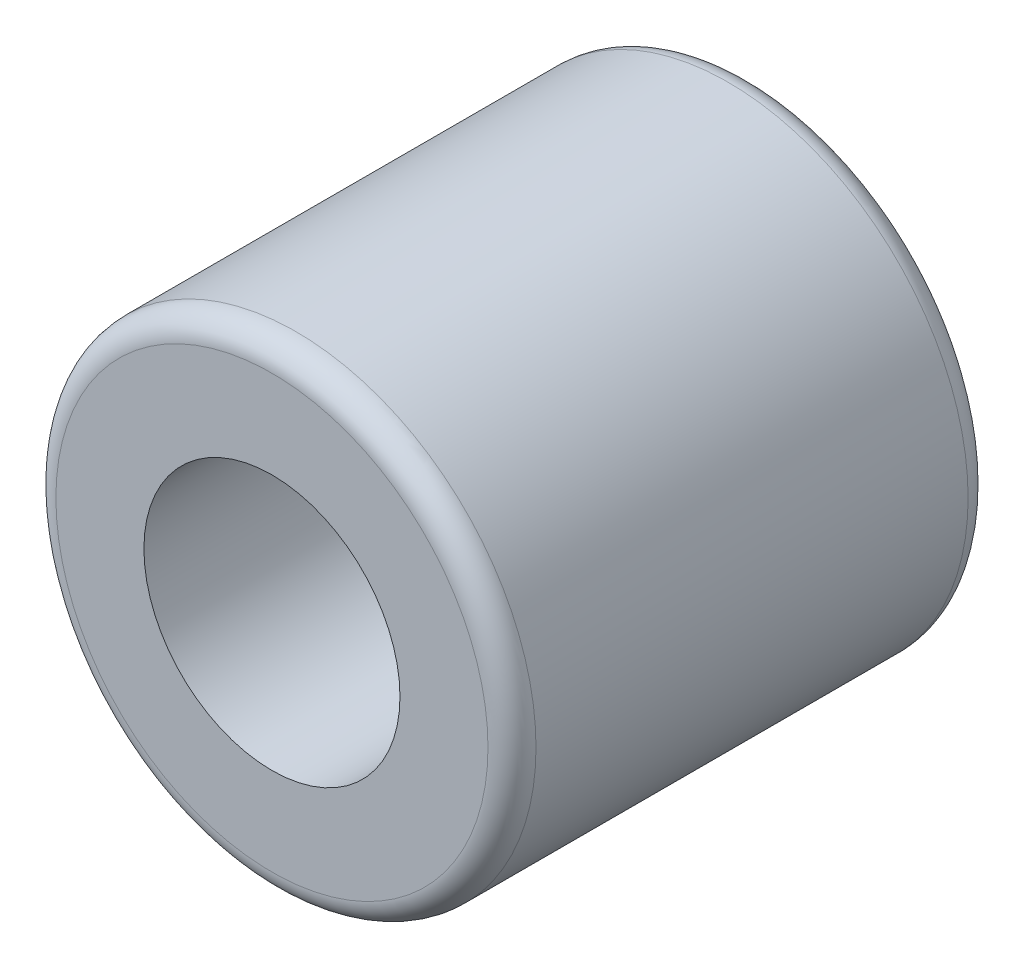
ISO-10303-21;
HEADER;
FILE_DESCRIPTION(('STEP AP214'),'2;1');
FILE_NAME('part.step','',(''),(''),'','','');
FILE_SCHEMA(('AUTOMOTIVE_DESIGN { 1 0 10303 214 1 1 1 1 }'));
ENDSEC;
DATA;
#1=APPLICATION_CONTEXT('core data for automotive mechanical design processes');
#2=APPLICATION_PROTOCOL_DEFINITION('international standard','automotive_design',2000,#1);
#3=PRODUCT_CONTEXT('',#1,'mechanical');
#4=PRODUCT('Part','Part','',(#3));
#5=PRODUCT_RELATED_PRODUCT_CATEGORY('part','',(#4));
#6=PRODUCT_DEFINITION_FORMATION('','',#4);
#7=PRODUCT_DEFINITION_CONTEXT('part definition',#1,'design');
#8=PRODUCT_DEFINITION('design','',#6,#7);
#9=PRODUCT_DEFINITION_SHAPE('','',#8);
#10=(LENGTH_UNIT() NAMED_UNIT(*) SI_UNIT(.MILLI.,.METRE.));
#11=(NAMED_UNIT(*) PLANE_ANGLE_UNIT() SI_UNIT($,.RADIAN.));
#12=(NAMED_UNIT(*) SI_UNIT($,.STERADIAN.) SOLID_ANGLE_UNIT());
#13=UNCERTAINTY_MEASURE_WITH_UNIT(LENGTH_MEASURE(1.E-05),#10,'distance_accuracy_value','');
#14=(GEOMETRIC_REPRESENTATION_CONTEXT(3) GLOBAL_UNCERTAINTY_ASSIGNED_CONTEXT((#13)) GLOBAL_UNIT_ASSIGNED_CONTEXT((#10,
#11,#12)) REPRESENTATION_CONTEXT('',''));
#15=CARTESIAN_POINT('',(0.,0.,0.));
#16=DIRECTION('',(0.,0.,1.));
#17=DIRECTION('',(1.,0.,0.));
#18=AXIS2_PLACEMENT_3D('',#15,#16,#17);
#19=CARTESIAN_POINT('',(0.,0.,6.));
#20=DIRECTION('',(0.,0.,1.));
#21=DIRECTION('',(1.,0.,0.));
#22=AXIS2_PLACEMENT_3D('',#19,#20,#21);
#23=PLANE('',#22);
#24=CARTESIAN_POINT('',(0.,0.,6.));
#25=DIRECTION('',(0.,0.,1.));
#26=DIRECTION('',(1.,0.,0.));
#27=AXIS2_PLACEMENT_3D('',#24,#25,#26);
#28=CIRCLE('',#27,2.7);
#29=CARTESIAN_POINT('',(2.7,0.,6.));
#30=VERTEX_POINT('',#29);
#31=EDGE_CURVE('E10',#30,#30,#28,.T.);
#32=ORIENTED_EDGE('',*,*,#31,.T.);
#33=EDGE_LOOP('',(#32));
#34=FACE_BOUND('',#33,.T.);
#35=CARTESIAN_POINT('',(0.,0.,6.));
#36=DIRECTION('',(0.,0.,1.));
#37=DIRECTION('',(1.,0.,0.));
#38=AXIS2_PLACEMENT_3D('',#35,#36,#37);
#39=CIRCLE('',#38,1.6);
#40=CARTESIAN_POINT('',(1.6,0.,6.));
#41=VERTEX_POINT('',#40);
#42=EDGE_CURVE('E51',#41,#41,#39,.T.);
#43=ORIENTED_EDGE('',*,*,#42,.F.);
#44=EDGE_LOOP('',(#43));
#45=FACE_BOUND('',#44,.T.);
#46=ADVANCED_FACE('F31',(#34,#45),#23,.T.);
#47=CARTESIAN_POINT('',(0.,0.,0.));
#48=DIRECTION('',(0.,0.,1.));
#49=DIRECTION('',(1.,0.,0.));
#50=AXIS2_PLACEMENT_3D('',#47,#48,#49);
#51=PLANE('',#50);
#52=CARTESIAN_POINT('',(0.,0.,0.));
#53=DIRECTION('',(0.,0.,1.));
#54=DIRECTION('',(1.,0.,0.));
#55=AXIS2_PLACEMENT_3D('',#52,#53,#54);
#56=CIRCLE('',#55,2.7);
#57=CARTESIAN_POINT('',(2.7,0.,0.));
#58=VERTEX_POINT('',#57);
#59=EDGE_CURVE('E38',#58,#58,#56,.F.);
#60=ORIENTED_EDGE('',*,*,#59,.T.);
#61=EDGE_LOOP('',(#60));
#62=FACE_BOUND('',#61,.T.);
#63=CARTESIAN_POINT('',(0.,0.,0.));
#64=DIRECTION('',(0.,0.,1.));
#65=DIRECTION('',(1.,0.,0.));
#66=AXIS2_PLACEMENT_3D('',#63,#64,#65);
#67=CIRCLE('',#66,1.6);
#68=CARTESIAN_POINT('',(1.6,0.,0.));
#69=VERTEX_POINT('',#68);
#70=EDGE_CURVE('E52',#69,#69,#67,.T.);
#71=ORIENTED_EDGE('',*,*,#70,.T.);
#72=EDGE_LOOP('',(#71));
#73=FACE_BOUND('',#72,.T.);
#74=ADVANCED_FACE('F62',(#62,#73),#51,.F.);
#75=CARTESIAN_POINT('',(0.,0.,6.));
#76=DIRECTION('',(0.,0.,-1.));
#77=DIRECTION('',(-1.,0.,0.));
#78=AXIS2_PLACEMENT_3D('',#75,#76,#77);
#79=CYLINDRICAL_SURFACE('',#78,3.);
#80=CARTESIAN_POINT('',(0.,0.,0.3));
#81=DIRECTION('',(0.,0.,1.));
#82=DIRECTION('',(1.,0.,0.));
#83=AXIS2_PLACEMENT_3D('',#80,#81,#82);
#84=CIRCLE('',#83,3.);
#85=CARTESIAN_POINT('',(3.,0.,0.3));
#86=VERTEX_POINT('',#85);
#87=EDGE_CURVE('E42',#86,#86,#84,.T.);
#88=ORIENTED_EDGE('',*,*,#87,.T.);
#89=EDGE_LOOP('',(#88));
#90=FACE_BOUND('',#89,.T.);
#91=CARTESIAN_POINT('',(0.,0.,5.7));
#92=DIRECTION('',(0.,0.,1.));
#93=DIRECTION('',(1.,0.,0.));
#94=AXIS2_PLACEMENT_3D('',#91,#92,#93);
#95=CIRCLE('',#94,3.);
#96=CARTESIAN_POINT('',(3.,0.,5.7));
#97=VERTEX_POINT('',#96);
#98=EDGE_CURVE('E46',#97,#97,#95,.F.);
#99=ORIENTED_EDGE('',*,*,#98,.T.);
#100=EDGE_LOOP('',(#99));
#101=FACE_BOUND('',#100,.T.);
#102=ADVANCED_FACE('F67',(#90,#101),#79,.T.);
#103=CARTESIAN_POINT('',(0.,0.,6.));
#104=DIRECTION('',(0.,0.,-1.));
#105=DIRECTION('',(-1.,0.,0.));
#106=AXIS2_PLACEMENT_3D('',#103,#104,#105);
#107=CYLINDRICAL_SURFACE('',#106,1.6);
#108=ORIENTED_EDGE('',*,*,#42,.T.);
#109=EDGE_LOOP('',(#108));
#110=FACE_BOUND('',#109,.T.);
#111=ORIENTED_EDGE('',*,*,#70,.F.);
#112=EDGE_LOOP('',(#111));
#113=FACE_BOUND('',#112,.T.);
#114=ADVANCED_FACE('F58',(#110,#113),#107,.F.);
#115=CARTESIAN_POINT('',(0.,0.,0.3));
#116=DIRECTION('',(0.,0.,1.));
#117=DIRECTION('',(1.,0.,0.));
#118=AXIS2_PLACEMENT_3D('',#115,#116,#117);
#119=TOROIDAL_SURFACE('',#118,2.7,0.3);
#120=ORIENTED_EDGE('',*,*,#59,.F.);
#121=EDGE_LOOP('',(#120));
#122=FACE_BOUND('',#121,.T.);
#123=ORIENTED_EDGE('',*,*,#87,.F.);
#124=EDGE_LOOP('',(#123));
#125=FACE_BOUND('',#124,.T.);
#126=ADVANCED_FACE('F73',(#122,#125),#119,.T.);
#127=CARTESIAN_POINT('',(0.,0.,5.7));
#128=DIRECTION('',(0.,0.,1.));
#129=DIRECTION('',(1.,0.,0.));
#130=AXIS2_PLACEMENT_3D('',#127,#128,#129);
#131=TOROIDAL_SURFACE('',#130,2.7,0.3);
#132=ORIENTED_EDGE('',*,*,#98,.F.);
#133=EDGE_LOOP('',(#132));
#134=FACE_BOUND('',#133,.T.);
#135=ORIENTED_EDGE('',*,*,#31,.F.);
#136=EDGE_LOOP('',(#135));
#137=FACE_BOUND('',#136,.T.);
#138=ADVANCED_FACE('F33',(#134,#137),#131,.T.);
#139=CLOSED_SHELL('',(#46,#74,#102,#114,#126,#138));
#140=MANIFOLD_SOLID_BREP('B2',#139);
#141=ADVANCED_BREP_SHAPE_REPRESENTATION('',(#18,#140),#14);
#142=SHAPE_DEFINITION_REPRESENTATION(#9,#141);
ENDSEC;
END-ISO-10303-21;
